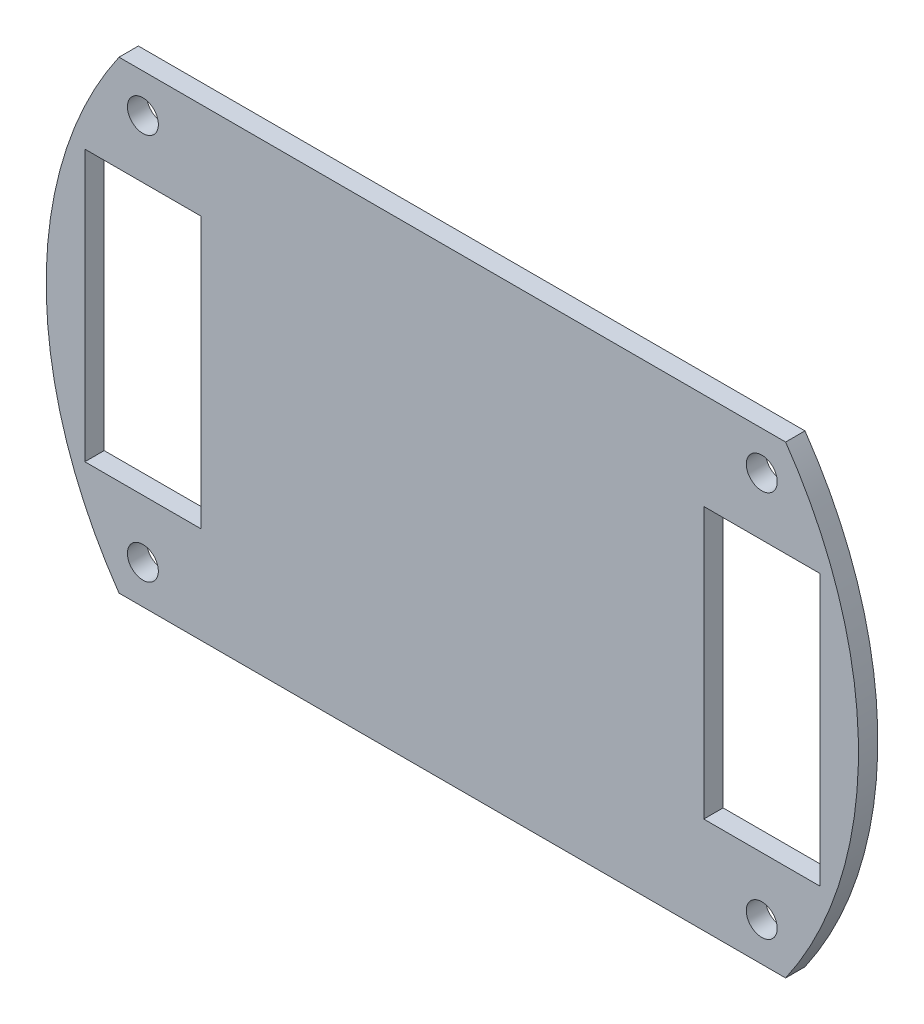
ISO-10303-21;
HEADER;
FILE_DESCRIPTION(('STEP AP214'),'2;1');
FILE_NAME('part.step','',(''),(''),'','','');
FILE_SCHEMA(('AUTOMOTIVE_DESIGN { 1 0 10303 214 1 1 1 1 }'));
ENDSEC;
DATA;
#1=APPLICATION_CONTEXT('core data for automotive mechanical design processes');
#2=APPLICATION_PROTOCOL_DEFINITION('international standard','automotive_design',2000,#1);
#3=PRODUCT_CONTEXT('',#1,'mechanical');
#4=PRODUCT('Part','Part','',(#3));
#5=PRODUCT_RELATED_PRODUCT_CATEGORY('part','',(#4));
#6=PRODUCT_DEFINITION_FORMATION('','',#4);
#7=PRODUCT_DEFINITION_CONTEXT('part definition',#1,'design');
#8=PRODUCT_DEFINITION('design','',#6,#7);
#9=PRODUCT_DEFINITION_SHAPE('','',#8);
#10=(LENGTH_UNIT() NAMED_UNIT(*) SI_UNIT(.MILLI.,.METRE.));
#11=(NAMED_UNIT(*) PLANE_ANGLE_UNIT() SI_UNIT($,.RADIAN.));
#12=(NAMED_UNIT(*) SI_UNIT($,.STERADIAN.) SOLID_ANGLE_UNIT());
#13=UNCERTAINTY_MEASURE_WITH_UNIT(LENGTH_MEASURE(1.E-05),#10,'distance_accuracy_value','');
#14=(GEOMETRIC_REPRESENTATION_CONTEXT(3) GLOBAL_UNCERTAINTY_ASSIGNED_CONTEXT((#13)) GLOBAL_UNIT_ASSIGNED_CONTEXT((#10,
#11,#12)) REPRESENTATION_CONTEXT('',''));
#15=CARTESIAN_POINT('',(0.,0.,0.));
#16=DIRECTION('',(0.,0.,1.));
#17=DIRECTION('',(1.,0.,0.));
#18=AXIS2_PLACEMENT_3D('',#15,#16,#17);
#19=CARTESIAN_POINT('',(0.,0.,5.));
#20=DIRECTION('',(0.,0.,-1.));
#21=DIRECTION('',(-1.,0.,0.));
#22=AXIS2_PLACEMENT_3D('',#19,#20,#21);
#23=CYLINDRICAL_SURFACE('',#22,105.);
#24=CARTESIAN_POINT('',(0.,0.,5.));
#25=DIRECTION('',(0.,0.,1.));
#26=DIRECTION('',(1.,0.,0.));
#27=AXIS2_PLACEMENT_3D('',#24,#25,#26);
#28=CIRCLE('',#27,105.);
#29=CARTESIAN_POINT('',(-86.1684396980704,60.,5.));
#30=VERTEX_POINT('',#29);
#31=CARTESIAN_POINT('',(-86.1684396980704,-60.,5.));
#32=VERTEX_POINT('',#31);
#33=EDGE_CURVE('E144',#30,#32,#28,.T.);
#34=ORIENTED_EDGE('',*,*,#33,.F.);
#35=DIRECTION('',(0.,0.,-1.));
#36=VECTOR('',#35,1.);
#37=CARTESIAN_POINT('',(-86.1684396980704,60.,5.));
#38=LINE('',#37,#36);
#39=CARTESIAN_POINT('',(-86.1684396980704,60.,0.));
#40=VERTEX_POINT('',#39);
#41=EDGE_CURVE('E11',#30,#40,#38,.T.);
#42=ORIENTED_EDGE('',*,*,#41,.T.);
#43=CARTESIAN_POINT('',(0.,0.,0.));
#44=DIRECTION('',(0.,0.,1.));
#45=DIRECTION('',(1.,0.,0.));
#46=AXIS2_PLACEMENT_3D('',#43,#44,#45);
#47=CIRCLE('',#46,105.);
#48=CARTESIAN_POINT('',(-86.1684396980704,-60.,0.));
#49=VERTEX_POINT('',#48);
#50=EDGE_CURVE('E148',#40,#49,#47,.T.);
#51=ORIENTED_EDGE('',*,*,#50,.T.);
#52=DIRECTION('',(0.,0.,-1.));
#53=VECTOR('',#52,1.);
#54=CARTESIAN_POINT('',(-86.1684396980704,-60.,5.));
#55=LINE('',#54,#53);
#56=EDGE_CURVE('E135',#49,#32,#55,.F.);
#57=ORIENTED_EDGE('',*,*,#56,.T.);
#58=EDGE_LOOP('',(#34,#42,#51,#57));
#59=FACE_BOUND('',#58,.T.);
#60=ADVANCED_FACE('F38',(#59),#23,.T.);
#61=CARTESIAN_POINT('',(0.,0.,5.));
#62=DIRECTION('',(0.,0.,1.));
#63=DIRECTION('',(1.,0.,0.));
#64=AXIS2_PLACEMENT_3D('',#61,#62,#63);
#65=PLANE('',#64);
#66=DIRECTION('',(1.,0.,0.));
#67=VECTOR('',#66,1.);
#68=CARTESIAN_POINT('',(125.,60.,5.));
#69=LINE('',#68,#67);
#70=CARTESIAN_POINT('',(86.1684396980704,60.,5.));
#71=VERTEX_POINT('',#70);
#72=EDGE_CURVE('E62',#30,#71,#69,.T.);
#73=ORIENTED_EDGE('',*,*,#72,.F.);
#74=ORIENTED_EDGE('',*,*,#33,.T.);
#75=DIRECTION('',(-1.,0.,0.));
#76=VECTOR('',#75,1.);
#77=CARTESIAN_POINT('',(125.,-60.,5.));
#78=LINE('',#77,#76);
#79=CARTESIAN_POINT('',(86.1684396980704,-60.,5.));
#80=VERTEX_POINT('',#79);
#81=EDGE_CURVE('E54',#80,#32,#78,.T.);
#82=ORIENTED_EDGE('',*,*,#81,.F.);
#83=EDGE_CURVE('E142',#80,#71,#28,.T.);
#84=ORIENTED_EDGE('',*,*,#83,.T.);
#85=EDGE_LOOP('',(#73,#74,#82,#84));
#86=FACE_BOUND('',#85,.T.);
#87=CARTESIAN_POINT('',(80.,-50.,5.));
#88=DIRECTION('',(0.,0.,1.));
#89=DIRECTION('',(1.,0.,0.));
#90=AXIS2_PLACEMENT_3D('',#87,#88,#89);
#91=CIRCLE('',#90,4.00000000000001);
#92=CARTESIAN_POINT('',(84.,-50.,5.));
#93=VERTEX_POINT('',#92);
#94=EDGE_CURVE('E184',#93,#93,#91,.T.);
#95=ORIENTED_EDGE('',*,*,#94,.F.);
#96=EDGE_LOOP('',(#95));
#97=FACE_BOUND('',#96,.T.);
#98=CARTESIAN_POINT('',(-80.,50.,5.));
#99=DIRECTION('',(0.,0.,1.));
#100=DIRECTION('',(1.,0.,0.));
#101=AXIS2_PLACEMENT_3D('',#98,#99,#100);
#102=CIRCLE('',#101,4.00000000000001);
#103=CARTESIAN_POINT('',(-76.,50.,5.));
#104=VERTEX_POINT('',#103);
#105=EDGE_CURVE('E200',#104,#104,#102,.T.);
#106=ORIENTED_EDGE('',*,*,#105,.F.);
#107=EDGE_LOOP('',(#106));
#108=FACE_BOUND('',#107,.T.);
#109=DIRECTION('',(-1.,0.,0.));
#110=VECTOR('',#109,1.);
#111=CARTESIAN_POINT('',(-95.,35.,5.));
#112=LINE('',#111,#110);
#113=CARTESIAN_POINT('',(-65.,35.,5.));
#114=VERTEX_POINT('',#113);
#115=CARTESIAN_POINT('',(-95.,35.,5.));
#116=VERTEX_POINT('',#115);
#117=EDGE_CURVE('E254',#114,#116,#112,.T.);
#118=ORIENTED_EDGE('',*,*,#117,.F.);
#119=DIRECTION('',(0.,1.,0.));
#120=VECTOR('',#119,1.);
#121=CARTESIAN_POINT('',(-65.,35.,5.));
#122=LINE('',#121,#120);
#123=CARTESIAN_POINT('',(-65.,-35.,5.));
#124=VERTEX_POINT('',#123);
#125=EDGE_CURVE('E251',#124,#114,#122,.T.);
#126=ORIENTED_EDGE('',*,*,#125,.F.);
#127=DIRECTION('',(1.,0.,0.));
#128=VECTOR('',#127,1.);
#129=CARTESIAN_POINT('',(-95.,-35.,5.));
#130=LINE('',#129,#128);
#131=CARTESIAN_POINT('',(-95.,-35.,5.));
#132=VERTEX_POINT('',#131);
#133=EDGE_CURVE('E262',#132,#124,#130,.T.);
#134=ORIENTED_EDGE('',*,*,#133,.F.);
#135=DIRECTION('',(0.,-1.,0.));
#136=VECTOR('',#135,1.);
#137=CARTESIAN_POINT('',(-95.,35.,5.));
#138=LINE('',#137,#136);
#139=EDGE_CURVE('E258',#116,#132,#138,.T.);
#140=ORIENTED_EDGE('',*,*,#139,.F.);
#141=EDGE_LOOP('',(#118,#126,#134,#140));
#142=FACE_BOUND('',#141,.T.);
#143=DIRECTION('',(-1.,0.,0.));
#144=VECTOR('',#143,1.);
#145=CARTESIAN_POINT('',(95.,35.,5.));
#146=LINE('',#145,#144);
#147=CARTESIAN_POINT('',(95.,35.,5.));
#148=VERTEX_POINT('',#147);
#149=CARTESIAN_POINT('',(65.,35.,5.));
#150=VERTEX_POINT('',#149);
#151=EDGE_CURVE('E211',#148,#150,#146,.T.);
#152=ORIENTED_EDGE('',*,*,#151,.F.);
#153=DIRECTION('',(0.,1.,0.));
#154=VECTOR('',#153,1.);
#155=CARTESIAN_POINT('',(95.,35.,5.));
#156=LINE('',#155,#154);
#157=CARTESIAN_POINT('',(95.,-35.,5.));
#158=VERTEX_POINT('',#157);
#159=EDGE_CURVE('E208',#158,#148,#156,.T.);
#160=ORIENTED_EDGE('',*,*,#159,.F.);
#161=DIRECTION('',(1.,0.,0.));
#162=VECTOR('',#161,1.);
#163=CARTESIAN_POINT('',(95.,-35.,5.));
#164=LINE('',#163,#162);
#165=CARTESIAN_POINT('',(65.,-35.,5.));
#166=VERTEX_POINT('',#165);
#167=EDGE_CURVE('E219',#166,#158,#164,.T.);
#168=ORIENTED_EDGE('',*,*,#167,.F.);
#169=DIRECTION('',(0.,-1.,0.));
#170=VECTOR('',#169,1.);
#171=CARTESIAN_POINT('',(65.,35.,5.));
#172=LINE('',#171,#170);
#173=EDGE_CURVE('E215',#150,#166,#172,.T.);
#174=ORIENTED_EDGE('',*,*,#173,.F.);
#175=EDGE_LOOP('',(#152,#160,#168,#174));
#176=FACE_BOUND('',#175,.T.);
#177=CARTESIAN_POINT('',(80.,50.,5.));
#178=DIRECTION('',(0.,0.,1.));
#179=DIRECTION('',(-1.,0.,0.));
#180=AXIS2_PLACEMENT_3D('',#177,#178,#179);
#181=CIRCLE('',#180,4.00000000000001);
#182=CARTESIAN_POINT('',(76.,50.,5.));
#183=VERTEX_POINT('',#182);
#184=EDGE_CURVE('E192',#183,#183,#181,.T.);
#185=ORIENTED_EDGE('',*,*,#184,.F.);
#186=EDGE_LOOP('',(#185));
#187=FACE_BOUND('',#186,.T.);
#188=CARTESIAN_POINT('',(-80.,-50.,5.));
#189=DIRECTION('',(0.,0.,1.));
#190=DIRECTION('',(-1.,0.,0.));
#191=AXIS2_PLACEMENT_3D('',#188,#189,#190);
#192=CIRCLE('',#191,4.00000000000001);
#193=CARTESIAN_POINT('',(-84.,-50.,5.));
#194=VERTEX_POINT('',#193);
#195=EDGE_CURVE('E175',#194,#194,#192,.T.);
#196=ORIENTED_EDGE('',*,*,#195,.F.);
#197=EDGE_LOOP('',(#196));
#198=FACE_BOUND('',#197,.T.);
#199=ADVANCED_FACE('F140',(#86,#97,#108,#142,#176,#187,#198),#65,.T.);
#200=CARTESIAN_POINT('',(0.,0.,0.));
#201=DIRECTION('',(0.,0.,1.));
#202=DIRECTION('',(1.,0.,0.));
#203=AXIS2_PLACEMENT_3D('',#200,#201,#202);
#204=PLANE('',#203);
#205=DIRECTION('',(0.,1.,0.));
#206=VECTOR('',#205,1.);
#207=CARTESIAN_POINT('',(-65.,35.,0.));
#208=LINE('',#207,#206);
#209=CARTESIAN_POINT('',(-65.,-35.,0.));
#210=VERTEX_POINT('',#209);
#211=CARTESIAN_POINT('',(-65.,35.,0.));
#212=VERTEX_POINT('',#211);
#213=EDGE_CURVE('E250',#210,#212,#208,.T.);
#214=ORIENTED_EDGE('',*,*,#213,.T.);
#215=DIRECTION('',(-1.,0.,0.));
#216=VECTOR('',#215,1.);
#217=CARTESIAN_POINT('',(-95.,35.,0.));
#218=LINE('',#217,#216);
#219=CARTESIAN_POINT('',(-95.,35.,0.));
#220=VERTEX_POINT('',#219);
#221=EDGE_CURVE('E269',#212,#220,#218,.T.);
#222=ORIENTED_EDGE('',*,*,#221,.T.);
#223=DIRECTION('',(0.,-1.,0.));
#224=VECTOR('',#223,1.);
#225=CARTESIAN_POINT('',(-95.,35.,0.));
#226=LINE('',#225,#224);
#227=CARTESIAN_POINT('',(-95.,-35.,0.));
#228=VERTEX_POINT('',#227);
#229=EDGE_CURVE('E273',#220,#228,#226,.T.);
#230=ORIENTED_EDGE('',*,*,#229,.T.);
#231=DIRECTION('',(1.,0.,0.));
#232=VECTOR('',#231,1.);
#233=CARTESIAN_POINT('',(-95.,-35.,0.));
#234=LINE('',#233,#232);
#235=EDGE_CURVE('E255',#228,#210,#234,.T.);
#236=ORIENTED_EDGE('',*,*,#235,.T.);
#237=EDGE_LOOP('',(#214,#222,#230,#236));
#238=FACE_BOUND('',#237,.T.);
#239=ORIENTED_EDGE('',*,*,#50,.F.);
#240=DIRECTION('',(1.,0.,0.));
#241=VECTOR('',#240,1.);
#242=CARTESIAN_POINT('',(125.,60.,0.));
#243=LINE('',#242,#241);
#244=CARTESIAN_POINT('',(86.1684396980704,60.,0.));
#245=VERTEX_POINT('',#244);
#246=EDGE_CURVE('E171',#40,#245,#243,.T.);
#247=ORIENTED_EDGE('',*,*,#246,.T.);
#248=CARTESIAN_POINT('',(86.1684396980704,-60.,0.));
#249=VERTEX_POINT('',#248);
#250=EDGE_CURVE('E153',#249,#245,#47,.T.);
#251=ORIENTED_EDGE('',*,*,#250,.F.);
#252=DIRECTION('',(-1.,0.,0.));
#253=VECTOR('',#252,1.);
#254=CARTESIAN_POINT('',(125.,-60.,0.));
#255=LINE('',#254,#253);
#256=EDGE_CURVE('E129',#249,#49,#255,.T.);
#257=ORIENTED_EDGE('',*,*,#256,.T.);
#258=EDGE_LOOP('',(#239,#247,#251,#257));
#259=FACE_BOUND('',#258,.T.);
#260=DIRECTION('',(0.,1.,0.));
#261=VECTOR('',#260,1.);
#262=CARTESIAN_POINT('',(95.,35.,0.));
#263=LINE('',#262,#261);
#264=CARTESIAN_POINT('',(95.,-35.,0.));
#265=VERTEX_POINT('',#264);
#266=CARTESIAN_POINT('',(95.,35.,0.));
#267=VERTEX_POINT('',#266);
#268=EDGE_CURVE('E204',#265,#267,#263,.T.);
#269=ORIENTED_EDGE('',*,*,#268,.T.);
#270=DIRECTION('',(-1.,0.,0.));
#271=VECTOR('',#270,1.);
#272=CARTESIAN_POINT('',(95.,35.,0.));
#273=LINE('',#272,#271);
#274=CARTESIAN_POINT('',(65.,35.,0.));
#275=VERTEX_POINT('',#274);
#276=EDGE_CURVE('E226',#267,#275,#273,.T.);
#277=ORIENTED_EDGE('',*,*,#276,.T.);
#278=DIRECTION('',(0.,-1.,0.));
#279=VECTOR('',#278,1.);
#280=CARTESIAN_POINT('',(65.,35.,0.));
#281=LINE('',#280,#279);
#282=CARTESIAN_POINT('',(65.,-35.,0.));
#283=VERTEX_POINT('',#282);
#284=EDGE_CURVE('E230',#275,#283,#281,.T.);
#285=ORIENTED_EDGE('',*,*,#284,.T.);
#286=DIRECTION('',(1.,0.,0.));
#287=VECTOR('',#286,1.);
#288=CARTESIAN_POINT('',(95.,-35.,0.));
#289=LINE('',#288,#287);
#290=EDGE_CURVE('E212',#283,#265,#289,.T.);
#291=ORIENTED_EDGE('',*,*,#290,.T.);
#292=EDGE_LOOP('',(#269,#277,#285,#291));
#293=FACE_BOUND('',#292,.T.);
#294=CARTESIAN_POINT('',(-80.,50.,0.));
#295=DIRECTION('',(0.,0.,1.));
#296=DIRECTION('',(1.,0.,0.));
#297=AXIS2_PLACEMENT_3D('',#294,#295,#296);
#298=CIRCLE('',#297,4.00000000000001);
#299=CARTESIAN_POINT('',(-76.,50.,0.));
#300=VERTEX_POINT('',#299);
#301=EDGE_CURVE('E196',#300,#300,#298,.T.);
#302=ORIENTED_EDGE('',*,*,#301,.T.);
#303=EDGE_LOOP('',(#302));
#304=FACE_BOUND('',#303,.T.);
#305=CARTESIAN_POINT('',(80.,50.,0.));
#306=DIRECTION('',(0.,0.,1.));
#307=DIRECTION('',(-1.,0.,0.));
#308=AXIS2_PLACEMENT_3D('',#305,#306,#307);
#309=CIRCLE('',#308,4.00000000000001);
#310=CARTESIAN_POINT('',(76.,50.,0.));
#311=VERTEX_POINT('',#310);
#312=EDGE_CURVE('E188',#311,#311,#309,.T.);
#313=ORIENTED_EDGE('',*,*,#312,.T.);
#314=EDGE_LOOP('',(#313));
#315=FACE_BOUND('',#314,.T.);
#316=CARTESIAN_POINT('',(80.,-50.,0.));
#317=DIRECTION('',(0.,0.,1.));
#318=DIRECTION('',(1.,0.,0.));
#319=AXIS2_PLACEMENT_3D('',#316,#317,#318);
#320=CIRCLE('',#319,4.00000000000001);
#321=CARTESIAN_POINT('',(84.,-50.,0.));
#322=VERTEX_POINT('',#321);
#323=EDGE_CURVE('E179',#322,#322,#320,.T.);
#324=ORIENTED_EDGE('',*,*,#323,.T.);
#325=EDGE_LOOP('',(#324));
#326=FACE_BOUND('',#325,.T.);
#327=CARTESIAN_POINT('',(-80.,-50.,0.));
#328=DIRECTION('',(0.,0.,1.));
#329=DIRECTION('',(-1.,0.,0.));
#330=AXIS2_PLACEMENT_3D('',#327,#328,#329);
#331=CIRCLE('',#330,4.00000000000001);
#332=CARTESIAN_POINT('',(-84.,-50.,0.));
#333=VERTEX_POINT('',#332);
#334=EDGE_CURVE('E180',#333,#333,#331,.T.);
#335=ORIENTED_EDGE('',*,*,#334,.T.);
#336=EDGE_LOOP('',(#335));
#337=FACE_BOUND('',#336,.T.);
#338=ADVANCED_FACE('F165',(#238,#259,#293,#304,#315,#326,#337),#204,.F.);
#339=ORIENTED_EDGE('',*,*,#250,.T.);
#340=DIRECTION('',(0.,0.,-1.));
#341=VECTOR('',#340,1.);
#342=CARTESIAN_POINT('',(86.1684396980704,60.,5.));
#343=LINE('',#342,#341);
#344=EDGE_CURVE('E47',#245,#71,#343,.F.);
#345=ORIENTED_EDGE('',*,*,#344,.T.);
#346=ORIENTED_EDGE('',*,*,#83,.F.);
#347=DIRECTION('',(0.,0.,-1.));
#348=VECTOR('',#347,1.);
#349=CARTESIAN_POINT('',(86.1684396980704,-60.,5.));
#350=LINE('',#349,#348);
#351=EDGE_CURVE('E126',#80,#249,#350,.T.);
#352=ORIENTED_EDGE('',*,*,#351,.T.);
#353=EDGE_LOOP('',(#339,#345,#346,#352));
#354=FACE_BOUND('',#353,.T.);
#355=ADVANCED_FACE('F40',(#354),#23,.T.);
#356=CARTESIAN_POINT('',(-65.,35.,5.));
#357=DIRECTION('',(-1.,0.,0.));
#358=DIRECTION('',(0.,-1.,0.));
#359=AXIS2_PLACEMENT_3D('',#356,#357,#358);
#360=PLANE('',#359);
#361=ORIENTED_EDGE('',*,*,#213,.F.);
#362=DIRECTION('',(0.,0.,-1.));
#363=VECTOR('',#362,1.);
#364=CARTESIAN_POINT('',(-65.,-35.,5.));
#365=LINE('',#364,#363);
#366=EDGE_CURVE('E265',#124,#210,#365,.T.);
#367=ORIENTED_EDGE('',*,*,#366,.F.);
#368=ORIENTED_EDGE('',*,*,#125,.T.);
#369=DIRECTION('',(0.,0.,-1.));
#370=VECTOR('',#369,1.);
#371=CARTESIAN_POINT('',(-65.,35.,5.));
#372=LINE('',#371,#370);
#373=EDGE_CURVE('E156',#114,#212,#372,.T.);
#374=ORIENTED_EDGE('',*,*,#373,.T.);
#375=EDGE_LOOP('',(#361,#367,#368,#374));
#376=FACE_BOUND('',#375,.T.);
#377=ADVANCED_FACE('F294',(#376),#360,.T.);
#378=CARTESIAN_POINT('',(-95.,35.,5.));
#379=DIRECTION('',(0.,-1.,0.));
#380=DIRECTION('',(0.,0.,-1.));
#381=AXIS2_PLACEMENT_3D('',#378,#379,#380);
#382=PLANE('',#381);
#383=ORIENTED_EDGE('',*,*,#221,.F.);
#384=ORIENTED_EDGE('',*,*,#373,.F.);
#385=ORIENTED_EDGE('',*,*,#117,.T.);
#386=DIRECTION('',(0.,0.,-1.));
#387=VECTOR('',#386,1.);
#388=CARTESIAN_POINT('',(-95.,35.,5.));
#389=LINE('',#388,#387);
#390=EDGE_CURVE('E285',#116,#220,#389,.T.);
#391=ORIENTED_EDGE('',*,*,#390,.T.);
#392=EDGE_LOOP('',(#383,#384,#385,#391));
#393=FACE_BOUND('',#392,.T.);
#394=ADVANCED_FACE('F306',(#393),#382,.T.);
#395=CARTESIAN_POINT('',(-95.,35.,5.));
#396=DIRECTION('',(1.,0.,0.));
#397=DIRECTION('',(0.,0.,-1.));
#398=AXIS2_PLACEMENT_3D('',#395,#396,#397);
#399=PLANE('',#398);
#400=ORIENTED_EDGE('',*,*,#229,.F.);
#401=ORIENTED_EDGE('',*,*,#390,.F.);
#402=ORIENTED_EDGE('',*,*,#139,.T.);
#403=DIRECTION('',(0.,0.,-1.));
#404=VECTOR('',#403,1.);
#405=CARTESIAN_POINT('',(-95.,-35.,5.));
#406=LINE('',#405,#404);
#407=EDGE_CURVE('E283',#132,#228,#406,.T.);
#408=ORIENTED_EDGE('',*,*,#407,.T.);
#409=EDGE_LOOP('',(#400,#401,#402,#408));
#410=FACE_BOUND('',#409,.T.);
#411=ADVANCED_FACE('F308',(#410),#399,.T.);
#412=CARTESIAN_POINT('',(-95.,-35.,5.));
#413=DIRECTION('',(0.,1.,0.));
#414=DIRECTION('',(0.,0.,1.));
#415=AXIS2_PLACEMENT_3D('',#412,#413,#414);
#416=PLANE('',#415);
#417=ORIENTED_EDGE('',*,*,#235,.F.);
#418=ORIENTED_EDGE('',*,*,#407,.F.);
#419=ORIENTED_EDGE('',*,*,#133,.T.);
#420=ORIENTED_EDGE('',*,*,#366,.T.);
#421=EDGE_LOOP('',(#417,#418,#419,#420));
#422=FACE_BOUND('',#421,.T.);
#423=ADVANCED_FACE('F301',(#422),#416,.T.);
#424=CARTESIAN_POINT('',(95.,35.,5.));
#425=DIRECTION('',(-1.,0.,0.));
#426=DIRECTION('',(0.,0.,1.));
#427=AXIS2_PLACEMENT_3D('',#424,#425,#426);
#428=PLANE('',#427);
#429=ORIENTED_EDGE('',*,*,#268,.F.);
#430=DIRECTION('',(0.,0.,-1.));
#431=VECTOR('',#430,1.);
#432=CARTESIAN_POINT('',(95.,-35.,5.));
#433=LINE('',#432,#431);
#434=EDGE_CURVE('E222',#158,#265,#433,.T.);
#435=ORIENTED_EDGE('',*,*,#434,.F.);
#436=ORIENTED_EDGE('',*,*,#159,.T.);
#437=DIRECTION('',(0.,0.,-1.));
#438=VECTOR('',#437,1.);
#439=CARTESIAN_POINT('',(95.,35.,5.));
#440=LINE('',#439,#438);
#441=EDGE_CURVE('E246',#148,#267,#440,.T.);
#442=ORIENTED_EDGE('',*,*,#441,.T.);
#443=EDGE_LOOP('',(#429,#435,#436,#442));
#444=FACE_BOUND('',#443,.T.);
#445=ADVANCED_FACE('F315',(#444),#428,.T.);
#446=CARTESIAN_POINT('',(95.,35.,5.));
#447=DIRECTION('',(0.,-1.,0.));
#448=DIRECTION('',(1.,0.,0.));
#449=AXIS2_PLACEMENT_3D('',#446,#447,#448);
#450=PLANE('',#449);
#451=ORIENTED_EDGE('',*,*,#276,.F.);
#452=ORIENTED_EDGE('',*,*,#441,.F.);
#453=ORIENTED_EDGE('',*,*,#151,.T.);
#454=DIRECTION('',(0.,0.,-1.));
#455=VECTOR('',#454,1.);
#456=CARTESIAN_POINT('',(65.,35.,5.));
#457=LINE('',#456,#455);
#458=EDGE_CURVE('E243',#150,#275,#457,.T.);
#459=ORIENTED_EDGE('',*,*,#458,.T.);
#460=EDGE_LOOP('',(#451,#452,#453,#459));
#461=FACE_BOUND('',#460,.T.);
#462=ADVANCED_FACE('F401',(#461),#450,.T.);
#463=CARTESIAN_POINT('',(65.,35.,5.));
#464=DIRECTION('',(1.,0.,0.));
#465=DIRECTION('',(0.,1.,0.));
#466=AXIS2_PLACEMENT_3D('',#463,#464,#465);
#467=PLANE('',#466);
#468=ORIENTED_EDGE('',*,*,#284,.F.);
#469=ORIENTED_EDGE('',*,*,#458,.F.);
#470=ORIENTED_EDGE('',*,*,#173,.T.);
#471=DIRECTION('',(0.,0.,-1.));
#472=VECTOR('',#471,1.);
#473=CARTESIAN_POINT('',(65.,-35.,5.));
#474=LINE('',#473,#472);
#475=EDGE_CURVE('E240',#166,#283,#474,.T.);
#476=ORIENTED_EDGE('',*,*,#475,.T.);
#477=EDGE_LOOP('',(#468,#469,#470,#476));
#478=FACE_BOUND('',#477,.T.);
#479=ADVANCED_FACE('F391',(#478),#467,.T.);
#480=CARTESIAN_POINT('',(95.,-35.,5.));
#481=DIRECTION('',(0.,1.,0.));
#482=DIRECTION('',(-1.,0.,0.));
#483=AXIS2_PLACEMENT_3D('',#480,#481,#482);
#484=PLANE('',#483);
#485=ORIENTED_EDGE('',*,*,#290,.F.);
#486=ORIENTED_EDGE('',*,*,#475,.F.);
#487=ORIENTED_EDGE('',*,*,#167,.T.);
#488=ORIENTED_EDGE('',*,*,#434,.T.);
#489=EDGE_LOOP('',(#485,#486,#487,#488));
#490=FACE_BOUND('',#489,.T.);
#491=ADVANCED_FACE('F381',(#490),#484,.T.);
#492=CARTESIAN_POINT('',(-80.,50.,5.));
#493=DIRECTION('',(0.,0.,-1.));
#494=DIRECTION('',(-1.,0.,0.));
#495=AXIS2_PLACEMENT_3D('',#492,#493,#494);
#496=CYLINDRICAL_SURFACE('',#495,4.00000000000001);
#497=ORIENTED_EDGE('',*,*,#105,.T.);
#498=EDGE_LOOP('',(#497));
#499=FACE_BOUND('',#498,.T.);
#500=ORIENTED_EDGE('',*,*,#301,.F.);
#501=EDGE_LOOP('',(#500));
#502=FACE_BOUND('',#501,.T.);
#503=ADVANCED_FACE('F371',(#499,#502),#496,.F.);
#504=CARTESIAN_POINT('',(80.,50.,5.));
#505=DIRECTION('',(0.,0.,-1.));
#506=DIRECTION('',(-1.,0.,0.));
#507=AXIS2_PLACEMENT_3D('',#504,#505,#506);
#508=CYLINDRICAL_SURFACE('',#507,4.00000000000001);
#509=ORIENTED_EDGE('',*,*,#184,.T.);
#510=EDGE_LOOP('',(#509));
#511=FACE_BOUND('',#510,.T.);
#512=ORIENTED_EDGE('',*,*,#312,.F.);
#513=EDGE_LOOP('',(#512));
#514=FACE_BOUND('',#513,.T.);
#515=ADVANCED_FACE('F361',(#511,#514),#508,.F.);
#516=CARTESIAN_POINT('',(80.,-50.,5.));
#517=DIRECTION('',(0.,0.,-1.));
#518=DIRECTION('',(-1.,0.,0.));
#519=AXIS2_PLACEMENT_3D('',#516,#517,#518);
#520=CYLINDRICAL_SURFACE('',#519,4.00000000000001);
#521=ORIENTED_EDGE('',*,*,#94,.T.);
#522=EDGE_LOOP('',(#521));
#523=FACE_BOUND('',#522,.T.);
#524=ORIENTED_EDGE('',*,*,#323,.F.);
#525=EDGE_LOOP('',(#524));
#526=FACE_BOUND('',#525,.T.);
#527=ADVANCED_FACE('F350',(#523,#526),#520,.F.);
#528=CARTESIAN_POINT('',(-80.,-50.,5.));
#529=DIRECTION('',(0.,0.,-1.));
#530=DIRECTION('',(-1.,0.,0.));
#531=AXIS2_PLACEMENT_3D('',#528,#529,#530);
#532=CYLINDRICAL_SURFACE('',#531,4.00000000000001);
#533=ORIENTED_EDGE('',*,*,#195,.T.);
#534=EDGE_LOOP('',(#533));
#535=FACE_BOUND('',#534,.T.);
#536=ORIENTED_EDGE('',*,*,#334,.F.);
#537=EDGE_LOOP('',(#536));
#538=FACE_BOUND('',#537,.T.);
#539=ADVANCED_FACE('F346',(#535,#538),#532,.F.);
#540=CARTESIAN_POINT('',(125.,-60.,0.));
#541=DIRECTION('',(0.,1.,0.));
#542=DIRECTION('',(0.,0.,1.));
#543=AXIS2_PLACEMENT_3D('',#540,#541,#542);
#544=PLANE('',#543);
#545=ORIENTED_EDGE('',*,*,#81,.T.);
#546=ORIENTED_EDGE('',*,*,#56,.F.);
#547=ORIENTED_EDGE('',*,*,#256,.F.);
#548=ORIENTED_EDGE('',*,*,#351,.F.);
#549=EDGE_LOOP('',(#545,#546,#547,#548));
#550=FACE_BOUND('',#549,.T.);
#551=ADVANCED_FACE('F127',(#550),#544,.F.);
#552=CARTESIAN_POINT('',(125.,60.,0.));
#553=DIRECTION('',(0.,-1.,0.));
#554=DIRECTION('',(0.,0.,-1.));
#555=AXIS2_PLACEMENT_3D('',#552,#553,#554);
#556=PLANE('',#555);
#557=ORIENTED_EDGE('',*,*,#72,.T.);
#558=ORIENTED_EDGE('',*,*,#344,.F.);
#559=ORIENTED_EDGE('',*,*,#246,.F.);
#560=ORIENTED_EDGE('',*,*,#41,.F.);
#561=EDGE_LOOP('',(#557,#558,#559,#560));
#562=FACE_BOUND('',#561,.T.);
#563=ADVANCED_FACE('F455',(#562),#556,.F.);
#564=CLOSED_SHELL('',(#60,#199,#338,#355,#377,#394,#411,#423,#445,#462,#479,#491,#503,#515,#527,
#539,#551,#563));
#565=MANIFOLD_SOLID_BREP('B2',#564);
#566=ADVANCED_BREP_SHAPE_REPRESENTATION('',(#18,#565),#14);
#567=SHAPE_DEFINITION_REPRESENTATION(#9,#566);
ENDSEC;
END-ISO-10303-21;
